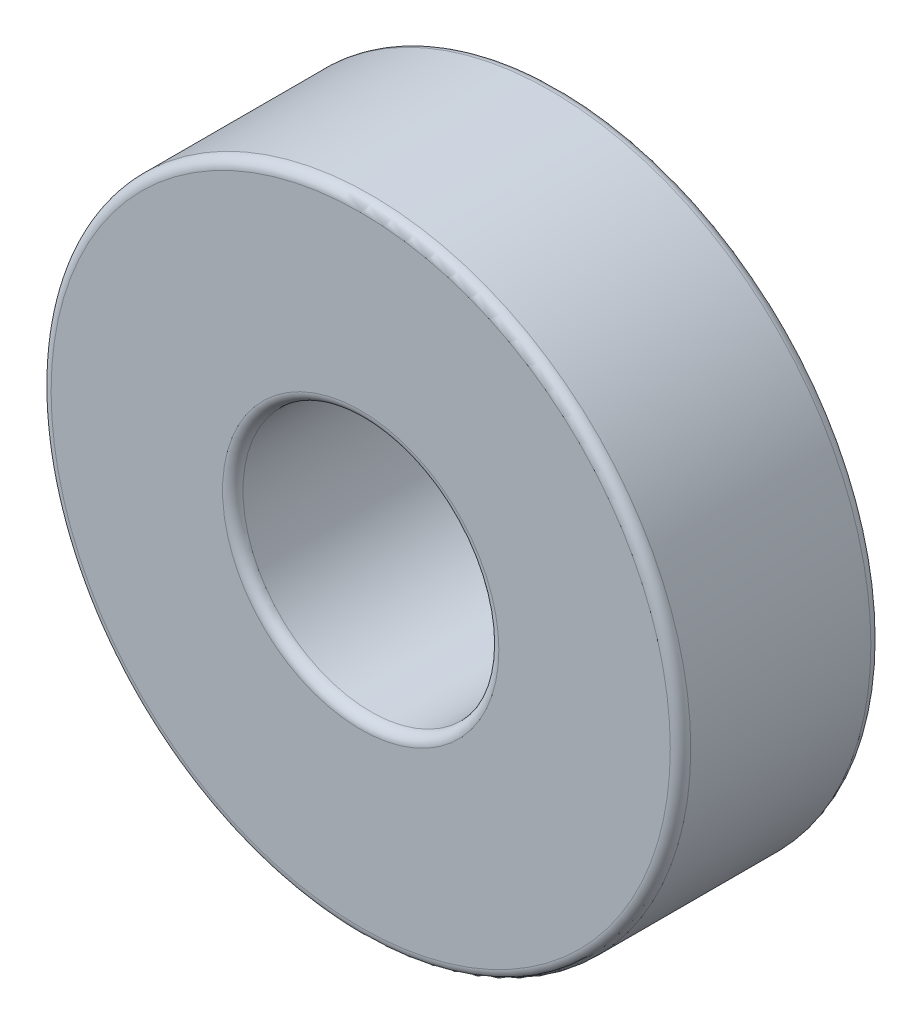
ISO-10303-21;
HEADER;
FILE_DESCRIPTION(('STEP AP214'),'2;1');
FILE_NAME('part.step','',(''),(''),'','','');
FILE_SCHEMA(('AUTOMOTIVE_DESIGN { 1 0 10303 214 1 1 1 1 }'));
ENDSEC;
DATA;
#1=APPLICATION_CONTEXT('core data for automotive mechanical design processes');
#2=APPLICATION_PROTOCOL_DEFINITION('international standard','automotive_design',2000,#1);
#3=PRODUCT_CONTEXT('',#1,'mechanical');
#4=PRODUCT('Part','Part','',(#3));
#5=PRODUCT_RELATED_PRODUCT_CATEGORY('part','',(#4));
#6=PRODUCT_DEFINITION_FORMATION('','',#4);
#7=PRODUCT_DEFINITION_CONTEXT('part definition',#1,'design');
#8=PRODUCT_DEFINITION('design','',#6,#7);
#9=PRODUCT_DEFINITION_SHAPE('','',#8);
#10=(LENGTH_UNIT() NAMED_UNIT(*) SI_UNIT(.MILLI.,.METRE.));
#11=(NAMED_UNIT(*) PLANE_ANGLE_UNIT() SI_UNIT($,.RADIAN.));
#12=(NAMED_UNIT(*) SI_UNIT($,.STERADIAN.) SOLID_ANGLE_UNIT());
#13=UNCERTAINTY_MEASURE_WITH_UNIT(LENGTH_MEASURE(1.E-05),#10,'distance_accuracy_value','');
#14=(GEOMETRIC_REPRESENTATION_CONTEXT(3) GLOBAL_UNCERTAINTY_ASSIGNED_CONTEXT((#13)) GLOBAL_UNIT_ASSIGNED_CONTEXT((#10,
#11,#12)) REPRESENTATION_CONTEXT('',''));
#15=CARTESIAN_POINT('',(0.,0.,0.));
#16=DIRECTION('',(0.,0.,1.));
#17=DIRECTION('',(1.,0.,0.));
#18=AXIS2_PLACEMENT_3D('',#15,#16,#17);
#19=CARTESIAN_POINT('',(0.,0.,-4.9784));
#20=DIRECTION('',(0.,0.,1.));
#21=DIRECTION('',(1.,0.,0.));
#22=AXIS2_PLACEMENT_3D('',#19,#20,#21);
#23=CYLINDRICAL_SURFACE('',#22,7.9375);
#24=CARTESIAN_POINT('',(0.,0.,-4.7244));
#25=DIRECTION('',(0.,0.,1.));
#26=DIRECTION('',(1.,0.,0.));
#27=AXIS2_PLACEMENT_3D('',#24,#25,#26);
#28=CIRCLE('',#27,7.9375);
#29=CARTESIAN_POINT('',(7.9375,0.,-4.7244));
#30=VERTEX_POINT('',#29);
#31=EDGE_CURVE('E10',#30,#30,#28,.T.);
#32=ORIENTED_EDGE('',*,*,#31,.T.);
#33=EDGE_LOOP('',(#32));
#34=FACE_BOUND('',#33,.T.);
#35=CARTESIAN_POINT('',(0.,0.,-0.254));
#36=DIRECTION('',(0.,0.,1.));
#37=DIRECTION('',(1.,0.,0.));
#38=AXIS2_PLACEMENT_3D('',#35,#36,#37);
#39=CIRCLE('',#38,7.9375);
#40=CARTESIAN_POINT('',(7.9375,0.,-0.254));
#41=VERTEX_POINT('',#40);
#42=EDGE_CURVE('E56',#41,#41,#39,.F.);
#43=ORIENTED_EDGE('',*,*,#42,.T.);
#44=EDGE_LOOP('',(#43));
#45=FACE_BOUND('',#44,.T.);
#46=ADVANCED_FACE('F30',(#34,#45),#23,.T.);
#47=CARTESIAN_POINT('',(0.,0.,-4.9784));
#48=DIRECTION('',(0.,0.,1.));
#49=DIRECTION('',(1.,0.,0.));
#50=AXIS2_PLACEMENT_3D('',#47,#48,#49);
#51=PLANE('',#50);
#52=CARTESIAN_POINT('',(0.,0.,-4.9784));
#53=DIRECTION('',(0.,0.,1.));
#54=DIRECTION('',(1.,0.,0.));
#55=AXIS2_PLACEMENT_3D('',#52,#53,#54);
#56=CIRCLE('',#55,3.429);
#57=CARTESIAN_POINT('',(3.429,0.,-4.9784));
#58=VERTEX_POINT('',#57);
#59=EDGE_CURVE('E37',#58,#58,#56,.T.);
#60=ORIENTED_EDGE('',*,*,#59,.T.);
#61=EDGE_LOOP('',(#60));
#62=FACE_BOUND('',#61,.T.);
#63=CARTESIAN_POINT('',(0.,0.,-4.9784));
#64=DIRECTION('',(0.,0.,1.));
#65=DIRECTION('',(1.,0.,0.));
#66=AXIS2_PLACEMENT_3D('',#63,#64,#65);
#67=CIRCLE('',#66,7.6835);
#68=CARTESIAN_POINT('',(7.6835,0.,-4.9784));
#69=VERTEX_POINT('',#68);
#70=EDGE_CURVE('E41',#69,#69,#67,.F.);
#71=ORIENTED_EDGE('',*,*,#70,.T.);
#72=EDGE_LOOP('',(#71));
#73=FACE_BOUND('',#72,.T.);
#74=ADVANCED_FACE('F83',(#62,#73),#51,.F.);
#75=CARTESIAN_POINT('',(0.,0.,0.));
#76=DIRECTION('',(0.,0.,1.));
#77=DIRECTION('',(1.,0.,0.));
#78=AXIS2_PLACEMENT_3D('',#75,#76,#77);
#79=PLANE('',#78);
#80=CARTESIAN_POINT('',(0.,0.,0.));
#81=DIRECTION('',(0.,0.,1.));
#82=DIRECTION('',(1.,0.,0.));
#83=AXIS2_PLACEMENT_3D('',#80,#81,#82);
#84=CIRCLE('',#83,3.429);
#85=CARTESIAN_POINT('',(3.429,0.,0.));
#86=VERTEX_POINT('',#85);
#87=EDGE_CURVE('E45',#86,#86,#84,.F.);
#88=ORIENTED_EDGE('',*,*,#87,.T.);
#89=EDGE_LOOP('',(#88));
#90=FACE_BOUND('',#89,.T.);
#91=CARTESIAN_POINT('',(0.,0.,0.));
#92=DIRECTION('',(0.,0.,1.));
#93=DIRECTION('',(1.,0.,0.));
#94=AXIS2_PLACEMENT_3D('',#91,#92,#93);
#95=CIRCLE('',#94,7.6835);
#96=CARTESIAN_POINT('',(7.6835,0.,0.));
#97=VERTEX_POINT('',#96);
#98=EDGE_CURVE('E59',#97,#97,#95,.T.);
#99=ORIENTED_EDGE('',*,*,#98,.T.);
#100=EDGE_LOOP('',(#99));
#101=FACE_BOUND('',#100,.T.);
#102=ADVANCED_FACE('F63',(#90,#101),#79,.T.);
#103=CARTESIAN_POINT('',(0.,0.,-4.9784));
#104=DIRECTION('',(0.,0.,1.));
#105=DIRECTION('',(1.,0.,0.));
#106=AXIS2_PLACEMENT_3D('',#103,#104,#105);
#107=CYLINDRICAL_SURFACE('',#106,3.175);
#108=CARTESIAN_POINT('',(0.,0.,-0.254));
#109=DIRECTION('',(0.,0.,1.));
#110=DIRECTION('',(1.,0.,0.));
#111=AXIS2_PLACEMENT_3D('',#108,#109,#110);
#112=CIRCLE('',#111,3.175);
#113=CARTESIAN_POINT('',(3.175,0.,-0.254));
#114=VERTEX_POINT('',#113);
#115=EDGE_CURVE('E50',#114,#114,#112,.T.);
#116=ORIENTED_EDGE('',*,*,#115,.T.);
#117=EDGE_LOOP('',(#116));
#118=FACE_BOUND('',#117,.T.);
#119=CARTESIAN_POINT('',(0.,0.,-4.7244));
#120=DIRECTION('',(0.,0.,1.));
#121=DIRECTION('',(1.,0.,0.));
#122=AXIS2_PLACEMENT_3D('',#119,#120,#121);
#123=CIRCLE('',#122,3.175);
#124=CARTESIAN_POINT('',(3.175,0.,-4.7244));
#125=VERTEX_POINT('',#124);
#126=EDGE_CURVE('E53',#125,#125,#123,.F.);
#127=ORIENTED_EDGE('',*,*,#126,.T.);
#128=EDGE_LOOP('',(#127));
#129=FACE_BOUND('',#128,.T.);
#130=ADVANCED_FACE('F68',(#118,#129),#107,.F.);
#131=CARTESIAN_POINT('',(0.,0.,-0.254));
#132=DIRECTION('',(0.,0.,1.));
#133=DIRECTION('',(1.,0.,0.));
#134=AXIS2_PLACEMENT_3D('',#131,#132,#133);
#135=TOROIDAL_SURFACE('',#134,7.6835,0.254);
#136=ORIENTED_EDGE('',*,*,#42,.F.);
#137=EDGE_LOOP('',(#136));
#138=FACE_BOUND('',#137,.T.);
#139=ORIENTED_EDGE('',*,*,#98,.F.);
#140=EDGE_LOOP('',(#139));
#141=FACE_BOUND('',#140,.T.);
#142=ADVANCED_FACE('F65',(#138,#141),#135,.T.);
#143=CARTESIAN_POINT('',(0.,0.,-0.254));
#144=DIRECTION('',(0.,0.,1.));
#145=DIRECTION('',(1.,0.,0.));
#146=AXIS2_PLACEMENT_3D('',#143,#144,#145);
#147=TOROIDAL_SURFACE('',#146,3.429,0.254);
#148=ORIENTED_EDGE('',*,*,#87,.F.);
#149=EDGE_LOOP('',(#148));
#150=FACE_BOUND('',#149,.T.);
#151=ORIENTED_EDGE('',*,*,#115,.F.);
#152=EDGE_LOOP('',(#151));
#153=FACE_BOUND('',#152,.T.);
#154=ADVANCED_FACE('F67',(#150,#153),#147,.T.);
#155=CARTESIAN_POINT('',(0.,0.,-4.7244));
#156=DIRECTION('',(0.,0.,1.));
#157=DIRECTION('',(1.,0.,0.));
#158=AXIS2_PLACEMENT_3D('',#155,#156,#157);
#159=TOROIDAL_SURFACE('',#158,3.429,0.254);
#160=ORIENTED_EDGE('',*,*,#126,.F.);
#161=EDGE_LOOP('',(#160));
#162=FACE_BOUND('',#161,.T.);
#163=ORIENTED_EDGE('',*,*,#59,.F.);
#164=EDGE_LOOP('',(#163));
#165=FACE_BOUND('',#164,.T.);
#166=ADVANCED_FACE('F75',(#162,#165),#159,.T.);
#167=CARTESIAN_POINT('',(0.,0.,-4.7244));
#168=DIRECTION('',(0.,0.,1.));
#169=DIRECTION('',(1.,0.,0.));
#170=AXIS2_PLACEMENT_3D('',#167,#168,#169);
#171=TOROIDAL_SURFACE('',#170,7.6835,0.254);
#172=ORIENTED_EDGE('',*,*,#70,.F.);
#173=EDGE_LOOP('',(#172));
#174=FACE_BOUND('',#173,.T.);
#175=ORIENTED_EDGE('',*,*,#31,.F.);
#176=EDGE_LOOP('',(#175));
#177=FACE_BOUND('',#176,.T.);
#178=ADVANCED_FACE('F32',(#174,#177),#171,.T.);
#179=CLOSED_SHELL('',(#46,#74,#102,#130,#142,#154,#166,#178));
#180=MANIFOLD_SOLID_BREP('B2',#179);
#181=ADVANCED_BREP_SHAPE_REPRESENTATION('',(#18,#180),#14);
#182=SHAPE_DEFINITION_REPRESENTATION(#9,#181);
ENDSEC;
END-ISO-10303-21;
